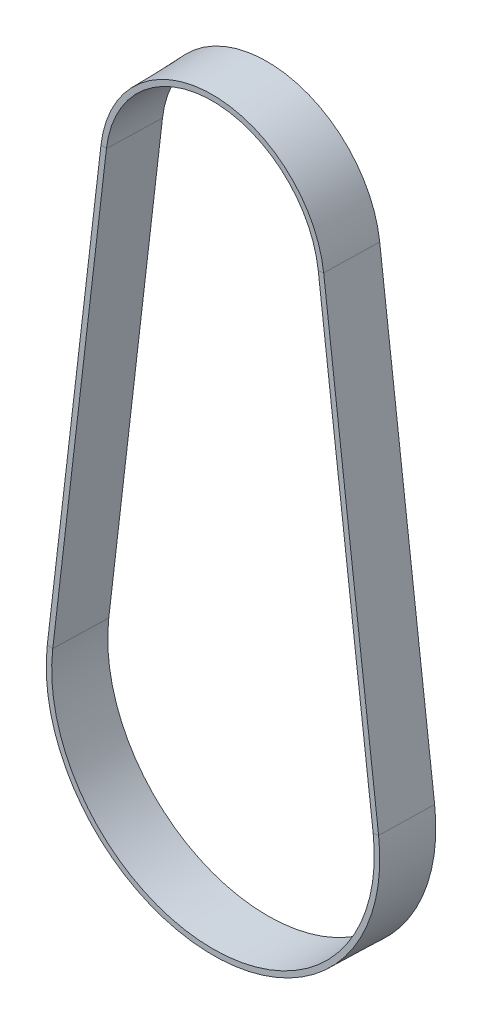
ISO-10303-21;
HEADER;
FILE_DESCRIPTION(('STEP AP214'),'2;1');
FILE_NAME('part.step','',(''),(''),'','','');
FILE_SCHEMA(('AUTOMOTIVE_DESIGN { 1 0 10303 214 1 1 1 1 }'));
ENDSEC;
DATA;
#1=APPLICATION_CONTEXT('core data for automotive mechanical design processes');
#2=APPLICATION_PROTOCOL_DEFINITION('international standard','automotive_design',2000,#1);
#3=PRODUCT_CONTEXT('',#1,'mechanical');
#4=PRODUCT('Part','Part','',(#3));
#5=PRODUCT_RELATED_PRODUCT_CATEGORY('part','',(#4));
#6=PRODUCT_DEFINITION_FORMATION('','',#4);
#7=PRODUCT_DEFINITION_CONTEXT('part definition',#1,'design');
#8=PRODUCT_DEFINITION('design','',#6,#7);
#9=PRODUCT_DEFINITION_SHAPE('','',#8);
#10=(LENGTH_UNIT() NAMED_UNIT(*) SI_UNIT(.MILLI.,.METRE.));
#11=(NAMED_UNIT(*) PLANE_ANGLE_UNIT() SI_UNIT($,.RADIAN.));
#12=(NAMED_UNIT(*) SI_UNIT($,.STERADIAN.) SOLID_ANGLE_UNIT());
#13=UNCERTAINTY_MEASURE_WITH_UNIT(LENGTH_MEASURE(1.E-05),#10,'distance_accuracy_value','');
#14=(GEOMETRIC_REPRESENTATION_CONTEXT(3) GLOBAL_UNCERTAINTY_ASSIGNED_CONTEXT((#13)) GLOBAL_UNIT_ASSIGNED_CONTEXT((#10,
#11,#12)) REPRESENTATION_CONTEXT('',''));
#15=CARTESIAN_POINT('',(0.,0.,0.));
#16=DIRECTION('',(0.,0.,1.));
#17=DIRECTION('',(1.,0.,0.));
#18=AXIS2_PLACEMENT_3D('',#15,#16,#17);
#19=CARTESIAN_POINT('',(-20.3616494908265,2.37765220600603,0.));
#20=DIRECTION('',(0.,0.,1.));
#21=DIRECTION('',(1.,0.,0.));
#22=AXIS2_PLACEMENT_3D('',#19,#20,#21);
#23=PLANE('',#22);
#24=CARTESIAN_POINT('',(0.,0.,0.));
#25=DIRECTION('',(0.,0.,-1.));
#26=DIRECTION('',(-0.993251194674463,0.115983034439319,0.));
#27=AXIS2_PLACEMENT_3D('',#24,#25,#26);
#28=CIRCLE('',#27,20.4999999999999);
#29=CARTESIAN_POINT('',(-20.3616494908265,2.377652206006,0.));
#30=VERTEX_POINT('',#29);
#31=CARTESIAN_POINT('',(20.3552622265429,2.43172771680434,0.));
#32=VERTEX_POINT('',#31);
#33=EDGE_CURVE('E11',#30,#32,#28,.T.);
#34=ORIENTED_EDGE('',*,*,#33,.F.);
#35=DIRECTION('',(0.99325119467446,-0.115983034439347,0.));
#36=VECTOR('',#35,1.);
#37=CARTESIAN_POINT('',(-20.3616494908265,2.37765220600603,0.));
#38=LINE('',#37,#36);
#39=CARTESIAN_POINT('',(-19.3683982961521,2.26166917156666,0.));
#40=VERTEX_POINT('',#39);
#41=EDGE_CURVE('E35',#30,#40,#38,.T.);
#42=ORIENTED_EDGE('',*,*,#41,.T.);
#43=CARTESIAN_POINT('',(0.,0.,0.));
#44=DIRECTION('',(0.,0.,-1.));
#45=DIRECTION('',(-0.993251194674463,0.115983034439318,0.));
#46=AXIS2_PLACEMENT_3D('',#43,#44,#45);
#47=CIRCLE('',#46,19.4999999999999);
#48=CARTESIAN_POINT('',(19.3623226057359,2.31310685257001,0.));
#49=VERTEX_POINT('',#48);
#50=EDGE_CURVE('E111',#40,#49,#47,.T.);
#51=ORIENTED_EDGE('',*,*,#50,.T.);
#52=DIRECTION('',(-0.992939620806976,-0.11862086423433,0.));
#53=VECTOR('',#52,1.);
#54=CARTESIAN_POINT('',(20.3552622265429,2.43172771680434,0.));
#55=LINE('',#54,#53);
#56=EDGE_CURVE('E114',#32,#49,#55,.T.);
#57=ORIENTED_EDGE('',*,*,#56,.F.);
#58=EDGE_LOOP('',(#34,#42,#51,#57));
#59=FACE_BOUND('',#58,.T.);
#60=ADVANCED_FACE('F32',(#59),#23,.T.);
#61=CARTESIAN_POINT('',(0.,0.,-10.));
#62=DIRECTION('',(0.,0.,-1.));
#63=DIRECTION('',(-1.,0.,0.));
#64=AXIS2_PLACEMENT_3D('',#61,#62,#63);
#65=CONICAL_SURFACE('',#64,20.7499999999999,0.0249947936189205);
#66=CARTESIAN_POINT('',(0.,0.,-10.));
#67=DIRECTION('',(0.,0.,-1.));
#68=DIRECTION('',(-0.993251194674463,0.11598303443932,0.));
#69=AXIS2_PLACEMENT_3D('',#66,#67,#68);
#70=CIRCLE('',#69,20.7499999999999);
#71=CARTESIAN_POINT('',(-20.6099622894951,2.40664796461583,-10.));
#72=VERTEX_POINT('',#71);
#73=CARTESIAN_POINT('',(20.6034971317446,2.46138293286292,-10.));
#74=VERTEX_POINT('',#73);
#75=EDGE_CURVE('E40',#72,#74,#70,.T.);
#76=ORIENTED_EDGE('',*,*,#75,.F.);
#77=DIRECTION('',(0.0248235237274045,-0.0028986701680486,0.999687646408123));
#78=VECTOR('',#77,1.);
#79=CARTESIAN_POINT('',(-20.6099622894951,2.40664796461586,-10.));
#80=LINE('',#79,#78);
#81=EDGE_CURVE('E184',#72,#30,#80,.T.);
#82=ORIENTED_EDGE('',*,*,#81,.T.);
#83=ORIENTED_EDGE('',*,*,#33,.T.);
#84=DIRECTION('',(-0.0248157368137478,-0.00296459531453291,0.999687646408123));
#85=VECTOR('',#84,1.);
#86=CARTESIAN_POINT('',(20.6034971317446,2.46138293286292,-10.));
#87=LINE('',#86,#85);
#88=EDGE_CURVE('E138',#74,#32,#87,.T.);
#89=ORIENTED_EDGE('',*,*,#88,.F.);
#90=EDGE_LOOP('',(#76,#82,#83,#89));
#91=FACE_BOUND('',#90,.T.);
#92=ADVANCED_FACE('F223',(#91),#65,.T.);
#93=CARTESIAN_POINT('',(-19.1200854974834,2.23267341295684,-10.));
#94=DIRECTION('',(0.,0.,-1.));
#95=DIRECTION('',(-1.,0.,0.));
#96=AXIS2_PLACEMENT_3D('',#93,#94,#95);
#97=PLANE('',#96);
#98=CARTESIAN_POINT('',(0.,0.,-10.));
#99=DIRECTION('',(0.,0.,-1.));
#100=DIRECTION('',(-0.993251194674463,0.115983034439318,0.));
#101=AXIS2_PLACEMENT_3D('',#98,#99,#100);
#102=CIRCLE('',#101,19.2499999999999);
#103=CARTESIAN_POINT('',(-19.1200854974834,2.23267341295681,-10.));
#104=VERTEX_POINT('',#103);
#105=CARTESIAN_POINT('',(19.1140877005342,2.28345163651142,-10.));
#106=VERTEX_POINT('',#105);
#107=EDGE_CURVE('E120',#104,#106,#102,.T.);
#108=ORIENTED_EDGE('',*,*,#107,.F.);
#109=DIRECTION('',(-0.99325119467446,0.115983034439347,0.));
#110=VECTOR('',#109,1.);
#111=CARTESIAN_POINT('',(-19.1200854974834,2.23267341295684,-10.));
#112=LINE('',#111,#110);
#113=EDGE_CURVE('E165',#104,#72,#112,.T.);
#114=ORIENTED_EDGE('',*,*,#113,.T.);
#115=ORIENTED_EDGE('',*,*,#75,.T.);
#116=DIRECTION('',(0.992939620806976,0.11862086423433,0.));
#117=VECTOR('',#116,1.);
#118=CARTESIAN_POINT('',(19.1140877005342,2.28345163651142,-10.));
#119=LINE('',#118,#117);
#120=EDGE_CURVE('E142',#106,#74,#119,.T.);
#121=ORIENTED_EDGE('',*,*,#120,.F.);
#122=EDGE_LOOP('',(#108,#114,#115,#121));
#123=FACE_BOUND('',#122,.T.);
#124=ADVANCED_FACE('F227',(#123),#97,.T.);
#125=CARTESIAN_POINT('',(-30.1809423098033,-81.712442267336,0.));
#126=DIRECTION('',(0.,0.,1.));
#127=DIRECTION('',(1.,0.,0.));
#128=AXIS2_PLACEMENT_3D('',#125,#126,#127);
#129=PLANE('',#128);
#130=ORIENTED_EDGE('',*,*,#41,.F.);
#131=DIRECTION('',(0.115983034439317,0.993251194674463,0.));
#132=VECTOR('',#131,1.);
#133=CARTESIAN_POINT('',(-30.1809423098033,-81.712442267336,0.));
#134=LINE('',#133,#132);
#135=CARTESIAN_POINT('',(-30.1809423098033,-81.712442267336,0.));
#136=VERTEX_POINT('',#135);
#137=EDGE_CURVE('E193',#136,#30,#134,.T.);
#138=ORIENTED_EDGE('',*,*,#137,.F.);
#139=DIRECTION('',(0.99325119467446,-0.115983034439347,0.));
#140=VECTOR('',#139,1.);
#141=CARTESIAN_POINT('',(-30.1809423098033,-81.712442267336,0.));
#142=LINE('',#141,#140);
#143=CARTESIAN_POINT('',(-29.1876911151288,-81.8284253017754,0.));
#144=VERTEX_POINT('',#143);
#145=EDGE_CURVE('E168',#136,#144,#142,.T.);
#146=ORIENTED_EDGE('',*,*,#145,.T.);
#147=DIRECTION('',(0.115983034439317,0.993251194674463,0.));
#148=VECTOR('',#147,1.);
#149=CARTESIAN_POINT('',(-29.1876911151288,-81.8284253017754,0.));
#150=LINE('',#149,#148);
#151=EDGE_CURVE('E162',#144,#40,#150,.T.);
#152=ORIENTED_EDGE('',*,*,#151,.T.);
#153=EDGE_LOOP('',(#130,#138,#146,#152));
#154=FACE_BOUND('',#153,.T.);
#155=ADVANCED_FACE('F200',(#154),#129,.T.);
#156=CARTESIAN_POINT('',(-30.4292551084719,-81.6834465087262,-10.));
#157=DIRECTION('',(-0.99294094909617,0.115946806721913,0.0249921911602034));
#158=DIRECTION('',(-0.115983034439317,-0.993251194674463,0.));
#159=AXIS2_PLACEMENT_3D('',#156,#157,#158);
#160=PLANE('',#159);
#161=ORIENTED_EDGE('',*,*,#137,.T.);
#162=ORIENTED_EDGE('',*,*,#81,.F.);
#163=DIRECTION('',(0.115983034439317,0.993251194674463,0.));
#164=VECTOR('',#163,1.);
#165=CARTESIAN_POINT('',(-30.4292551084719,-81.6834465087262,-10.));
#166=LINE('',#165,#164);
#167=CARTESIAN_POINT('',(-30.4292551084719,-81.6834465087262,-10.));
#168=VERTEX_POINT('',#167);
#169=EDGE_CURVE('E181',#168,#72,#166,.T.);
#170=ORIENTED_EDGE('',*,*,#169,.F.);
#171=DIRECTION('',(0.0248235237274045,-0.00289867016804861,0.999687646408123));
#172=VECTOR('',#171,1.);
#173=CARTESIAN_POINT('',(-30.4292551084719,-81.6834465087262,-10.));
#174=LINE('',#173,#172);
#175=EDGE_CURVE('E177',#168,#136,#174,.T.);
#176=ORIENTED_EDGE('',*,*,#175,.T.);
#177=EDGE_LOOP('',(#161,#162,#170,#176));
#178=FACE_BOUND('',#177,.T.);
#179=ADVANCED_FACE('F236',(#178),#160,.T.);
#180=CARTESIAN_POINT('',(-28.9393783164602,-81.8574210603852,-10.));
#181=DIRECTION('',(0.,0.,-1.));
#182=DIRECTION('',(-1.,0.,0.));
#183=AXIS2_PLACEMENT_3D('',#180,#181,#182);
#184=PLANE('',#183);
#185=ORIENTED_EDGE('',*,*,#169,.T.);
#186=ORIENTED_EDGE('',*,*,#113,.F.);
#187=DIRECTION('',(0.115983034439317,0.993251194674463,0.));
#188=VECTOR('',#187,1.);
#189=CARTESIAN_POINT('',(-28.9393783164602,-81.8574210603852,-10.));
#190=LINE('',#189,#188);
#191=CARTESIAN_POINT('',(-28.9393783164602,-81.8574210603852,-10.));
#192=VERTEX_POINT('',#191);
#193=EDGE_CURVE('E161',#192,#104,#190,.T.);
#194=ORIENTED_EDGE('',*,*,#193,.F.);
#195=DIRECTION('',(-0.99325119467446,0.115983034439347,0.));
#196=VECTOR('',#195,1.);
#197=CARTESIAN_POINT('',(-28.9393783164602,-81.8574210603852,-10.));
#198=LINE('',#197,#196);
#199=EDGE_CURVE('E154',#192,#168,#198,.T.);
#200=ORIENTED_EDGE('',*,*,#199,.T.);
#201=EDGE_LOOP('',(#185,#186,#194,#200));
#202=FACE_BOUND('',#201,.T.);
#203=ADVANCED_FACE('F208',(#202),#184,.T.);
#204=CARTESIAN_POINT('',(-29.1876911151288,-81.8284253017754,0.));
#205=DIRECTION('',(0.99294094909617,-0.115946806721913,0.024992191160203));
#206=DIRECTION('',(0.115983034439317,0.993251194674463,0.));
#207=AXIS2_PLACEMENT_3D('',#204,#205,#206);
#208=PLANE('',#207);
#209=ORIENTED_EDGE('',*,*,#193,.T.);
#210=DIRECTION('',(0.0248235237274041,-0.00289867016804856,-0.999687646408123));
#211=VECTOR('',#210,1.);
#212=CARTESIAN_POINT('',(-19.368398296152,2.26166917156668,0.));
#213=LINE('',#212,#211);
#214=EDGE_CURVE('E159',#40,#104,#213,.T.);
#215=ORIENTED_EDGE('',*,*,#214,.F.);
#216=ORIENTED_EDGE('',*,*,#151,.F.);
#217=DIRECTION('',(0.0248235237274041,-0.00289867016804857,-0.999687646408123));
#218=VECTOR('',#217,1.);
#219=CARTESIAN_POINT('',(-29.1876911151288,-81.8284253017754,0.));
#220=LINE('',#219,#218);
#221=EDGE_CURVE('E151',#144,#192,#220,.T.);
#222=ORIENTED_EDGE('',*,*,#221,.T.);
#223=EDGE_LOOP('',(#209,#215,#216,#222));
#224=FACE_BOUND('',#223,.T.);
#225=ADVANCED_FACE('F205',(#224),#208,.T.);
#226=CARTESIAN_POINT('',(30.3978775623805,-81.6319884585873,0.));
#227=DIRECTION('',(0.,0.,1.));
#228=DIRECTION('',(1.,0.,0.));
#229=AXIS2_PLACEMENT_3D('',#226,#227,#228);
#230=PLANE('',#229);
#231=ORIENTED_EDGE('',*,*,#145,.F.);
#232=CARTESIAN_POINT('',(0.113219127767822,-85.2499248177352,0.));
#233=DIRECTION('',(0.,0.,-1.));
#234=DIRECTION('',(0.992939620806972,0.118620864234359,0.));
#235=AXIS2_PLACEMENT_3D('',#232,#233,#234);
#236=CIRCLE('',#235,30.5);
#237=CARTESIAN_POINT('',(30.3978775623805,-81.6319884585872,0.));
#238=VERTEX_POINT('',#237);
#239=EDGE_CURVE('E76',#238,#136,#236,.T.);
#240=ORIENTED_EDGE('',*,*,#239,.F.);
#241=DIRECTION('',(-0.992939620806976,-0.11862086423433,0.));
#242=VECTOR('',#241,1.);
#243=CARTESIAN_POINT('',(30.3978775623805,-81.6319884585872,0.));
#244=LINE('',#243,#242);
#245=CARTESIAN_POINT('',(29.4049379415735,-81.7506093228215,0.));
#246=VERTEX_POINT('',#245);
#247=EDGE_CURVE('E158',#238,#246,#244,.T.);
#248=ORIENTED_EDGE('',*,*,#247,.T.);
#249=CARTESIAN_POINT('',(0.113219127767822,-85.2499248177352,0.));
#250=DIRECTION('',(0.,0.,-1.));
#251=DIRECTION('',(0.992939620806972,0.11862086423436,0.));
#252=AXIS2_PLACEMENT_3D('',#249,#250,#251);
#253=CIRCLE('',#252,29.5);
#254=EDGE_CURVE('E156',#246,#144,#253,.T.);
#255=ORIENTED_EDGE('',*,*,#254,.T.);
#256=EDGE_LOOP('',(#231,#240,#248,#255));
#257=FACE_BOUND('',#256,.T.);
#258=ADVANCED_FACE('F218',(#257),#230,.T.);
#259=CARTESIAN_POINT('',(0.113219127767822,-85.2499248177352,-10.));
#260=DIRECTION('',(0.,0.,-1.));
#261=DIRECTION('',(-1.,0.,0.));
#262=AXIS2_PLACEMENT_3D('',#259,#260,#261);
#263=CONICAL_SURFACE('',#262,30.75,0.0249947936189205);
#264=ORIENTED_EDGE('',*,*,#239,.T.);
#265=ORIENTED_EDGE('',*,*,#175,.F.);
#266=CARTESIAN_POINT('',(0.113219127767822,-85.2499248177352,-10.));
#267=DIRECTION('',(0.,0.,-1.));
#268=DIRECTION('',(0.992939620806972,0.118620864234359,0.));
#269=AXIS2_PLACEMENT_3D('',#266,#267,#268);
#270=CIRCLE('',#269,30.75);
#271=CARTESIAN_POINT('',(30.6461124675822,-81.6023332425286,-10.));
#272=VERTEX_POINT('',#271);
#273=EDGE_CURVE('E86',#272,#168,#270,.T.);
#274=ORIENTED_EDGE('',*,*,#273,.F.);
#275=DIRECTION('',(-0.0248157368137478,-0.00296459531453291,0.999687646408123));
#276=VECTOR('',#275,1.);
#277=CARTESIAN_POINT('',(30.6461124675822,-81.6023332425286,-10.));
#278=LINE('',#277,#276);
#279=EDGE_CURVE('E174',#272,#238,#278,.T.);
#280=ORIENTED_EDGE('',*,*,#279,.T.);
#281=EDGE_LOOP('',(#264,#265,#274,#280));
#282=FACE_BOUND('',#281,.T.);
#283=ADVANCED_FACE('F211',(#282),#263,.T.);
#284=CARTESIAN_POINT('',(29.1567030363718,-81.7802645388802,-10.));
#285=DIRECTION('',(0.,0.,-1.));
#286=DIRECTION('',(-1.,0.,0.));
#287=AXIS2_PLACEMENT_3D('',#284,#285,#286);
#288=PLANE('',#287);
#289=ORIENTED_EDGE('',*,*,#273,.T.);
#290=ORIENTED_EDGE('',*,*,#199,.F.);
#291=CARTESIAN_POINT('',(0.113219127767822,-85.2499248177352,-10.));
#292=DIRECTION('',(0.,0.,-1.));
#293=DIRECTION('',(0.992939620806972,0.11862086423436,0.));
#294=AXIS2_PLACEMENT_3D('',#291,#292,#293);
#295=CIRCLE('',#294,29.25);
#296=CARTESIAN_POINT('',(29.1567030363717,-81.7802645388801,-10.));
#297=VERTEX_POINT('',#296);
#298=EDGE_CURVE('E94',#297,#192,#295,.T.);
#299=ORIENTED_EDGE('',*,*,#298,.F.);
#300=DIRECTION('',(0.992939620806976,0.11862086423433,0.));
#301=VECTOR('',#300,1.);
#302=CARTESIAN_POINT('',(29.1567030363717,-81.7802645388801,-10.));
#303=LINE('',#302,#301);
#304=EDGE_CURVE('E149',#297,#272,#303,.T.);
#305=ORIENTED_EDGE('',*,*,#304,.T.);
#306=EDGE_LOOP('',(#289,#290,#299,#305));
#307=FACE_BOUND('',#306,.T.);
#308=ADVANCED_FACE('F209',(#307),#288,.T.);
#309=CARTESIAN_POINT('',(0.113219127767822,-85.2499248177352,0.));
#310=DIRECTION('',(0.,0.,1.));
#311=DIRECTION('',(1.,0.,0.));
#312=AXIS2_PLACEMENT_3D('',#309,#310,#311);
#313=CONICAL_SURFACE('',#312,29.5,0.0249947936189202);
#314=ORIENTED_EDGE('',*,*,#298,.T.);
#315=ORIENTED_EDGE('',*,*,#221,.F.);
#316=ORIENTED_EDGE('',*,*,#254,.F.);
#317=DIRECTION('',(-0.0248157368137474,-0.00296459531453286,-0.999687646408123));
#318=VECTOR('',#317,1.);
#319=CARTESIAN_POINT('',(29.4049379415735,-81.7506093228215,0.));
#320=LINE('',#319,#318);
#321=EDGE_CURVE('E130',#246,#297,#320,.T.);
#322=ORIENTED_EDGE('',*,*,#321,.T.);
#323=EDGE_LOOP('',(#314,#315,#316,#322));
#324=FACE_BOUND('',#323,.T.);
#325=ADVANCED_FACE('F203',(#324),#313,.F.);
#326=CARTESIAN_POINT('',(20.3552622265429,2.43172771680434,0.));
#327=DIRECTION('',(0.,0.,1.));
#328=DIRECTION('',(1.,0.,0.));
#329=AXIS2_PLACEMENT_3D('',#326,#327,#328);
#330=PLANE('',#329);
#331=ORIENTED_EDGE('',*,*,#247,.F.);
#332=DIRECTION('',(0.118620864234359,-0.992939620806972,0.));
#333=VECTOR('',#332,1.);
#334=CARTESIAN_POINT('',(20.3552622265429,2.43172771680434,0.));
#335=LINE('',#334,#333);
#336=EDGE_CURVE('E137',#32,#238,#335,.T.);
#337=ORIENTED_EDGE('',*,*,#336,.F.);
#338=ORIENTED_EDGE('',*,*,#56,.T.);
#339=DIRECTION('',(0.118620864234359,-0.992939620806972,0.));
#340=VECTOR('',#339,1.);
#341=CARTESIAN_POINT('',(19.3623226057359,2.31310685257001,0.));
#342=LINE('',#341,#340);
#343=EDGE_CURVE('E126',#49,#246,#342,.T.);
#344=ORIENTED_EDGE('',*,*,#343,.T.);
#345=EDGE_LOOP('',(#331,#337,#338,#344));
#346=FACE_BOUND('',#345,.T.);
#347=ADVANCED_FACE('F135',(#346),#330,.T.);
#348=CARTESIAN_POINT('',(20.6034971317446,2.46138293286292,-10.));
#349=DIRECTION('',(0.992629472549896,0.118583812581344,0.0249921911602034));
#350=DIRECTION('',(-0.118620864234359,0.992939620806972,0.));
#351=AXIS2_PLACEMENT_3D('',#348,#349,#350);
#352=PLANE('',#351);
#353=ORIENTED_EDGE('',*,*,#336,.T.);
#354=ORIENTED_EDGE('',*,*,#279,.F.);
#355=DIRECTION('',(0.118620864234359,-0.992939620806972,0.));
#356=VECTOR('',#355,1.);
#357=CARTESIAN_POINT('',(20.6034971317446,2.46138293286292,-10.));
#358=LINE('',#357,#356);
#359=EDGE_CURVE('E171',#74,#272,#358,.T.);
#360=ORIENTED_EDGE('',*,*,#359,.F.);
#361=ORIENTED_EDGE('',*,*,#88,.T.);
#362=EDGE_LOOP('',(#353,#354,#360,#361));
#363=FACE_BOUND('',#362,.T.);
#364=ADVANCED_FACE('F239',(#363),#352,.T.);
#365=CARTESIAN_POINT('',(19.1140877005342,2.28345163651142,-10.));
#366=DIRECTION('',(0.,0.,-1.));
#367=DIRECTION('',(-1.,0.,0.));
#368=AXIS2_PLACEMENT_3D('',#365,#366,#367);
#369=PLANE('',#368);
#370=ORIENTED_EDGE('',*,*,#359,.T.);
#371=ORIENTED_EDGE('',*,*,#304,.F.);
#372=DIRECTION('',(0.118620864234359,-0.992939620806972,0.));
#373=VECTOR('',#372,1.);
#374=CARTESIAN_POINT('',(19.1140877005342,2.28345163651142,-10.));
#375=LINE('',#374,#373);
#376=EDGE_CURVE('E148',#106,#297,#375,.T.);
#377=ORIENTED_EDGE('',*,*,#376,.F.);
#378=ORIENTED_EDGE('',*,*,#120,.T.);
#379=EDGE_LOOP('',(#370,#371,#377,#378));
#380=FACE_BOUND('',#379,.T.);
#381=ADVANCED_FACE('F253',(#380),#369,.T.);
#382=CARTESIAN_POINT('',(19.3623226057359,2.31310685257001,0.));
#383=DIRECTION('',(-0.992629472549896,-0.118583812581344,0.024992191160203));
#384=DIRECTION('',(0.118620864234359,-0.992939620806972,0.));
#385=AXIS2_PLACEMENT_3D('',#382,#383,#384);
#386=PLANE('',#385);
#387=ORIENTED_EDGE('',*,*,#376,.T.);
#388=ORIENTED_EDGE('',*,*,#321,.F.);
#389=ORIENTED_EDGE('',*,*,#343,.F.);
#390=DIRECTION('',(-0.0248157368137474,-0.00296459531453286,-0.999687646408123));
#391=VECTOR('',#390,1.);
#392=CARTESIAN_POINT('',(19.3623226057359,2.31310685257001,0.));
#393=LINE('',#392,#391);
#394=EDGE_CURVE('E129',#49,#106,#393,.T.);
#395=ORIENTED_EDGE('',*,*,#394,.T.);
#396=EDGE_LOOP('',(#387,#388,#389,#395));
#397=FACE_BOUND('',#396,.T.);
#398=ADVANCED_FACE('F128',(#397),#386,.T.);
#399=CARTESIAN_POINT('',(0.,0.,0.));
#400=DIRECTION('',(0.,0.,1.));
#401=DIRECTION('',(1.,0.,0.));
#402=AXIS2_PLACEMENT_3D('',#399,#400,#401);
#403=CONICAL_SURFACE('',#402,19.4999999999999,0.0249947936189202);
#404=ORIENTED_EDGE('',*,*,#214,.T.);
#405=ORIENTED_EDGE('',*,*,#107,.T.);
#406=ORIENTED_EDGE('',*,*,#394,.F.);
#407=ORIENTED_EDGE('',*,*,#50,.F.);
#408=EDGE_LOOP('',(#404,#405,#406,#407));
#409=FACE_BOUND('',#408,.T.);
#410=ADVANCED_FACE('F140',(#409),#403,.F.);
#411=CLOSED_SHELL('',(#60,#92,#124,#155,#179,#203,#225,#258,#283,#308,#325,#347,#364,#381,#398,#410));
#412=MANIFOLD_SOLID_BREP('B2',#411);
#413=ADVANCED_BREP_SHAPE_REPRESENTATION('',(#18,#412),#14);
#414=SHAPE_DEFINITION_REPRESENTATION(#9,#413);
ENDSEC;
END-ISO-10303-21;
